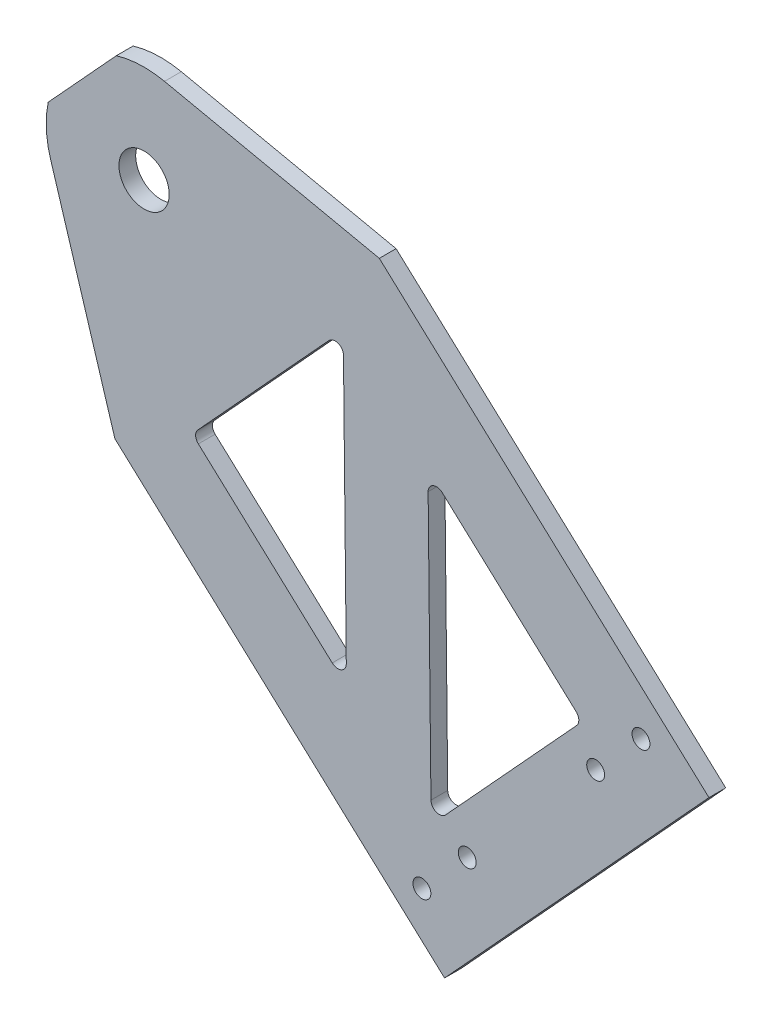
ISO-10303-21;
HEADER;
FILE_DESCRIPTION(('STEP AP214'),'2;1');
FILE_NAME('part.step','',(''),(''),'','','');
FILE_SCHEMA(('AUTOMOTIVE_DESIGN { 1 0 10303 214 1 1 1 1 }'));
ENDSEC;
DATA;
#1=APPLICATION_CONTEXT('core data for automotive mechanical design processes');
#2=APPLICATION_PROTOCOL_DEFINITION('international standard','automotive_design',2000,#1);
#3=PRODUCT_CONTEXT('',#1,'mechanical');
#4=PRODUCT('Part','Part','',(#3));
#5=PRODUCT_RELATED_PRODUCT_CATEGORY('part','',(#4));
#6=PRODUCT_DEFINITION_FORMATION('','',#4);
#7=PRODUCT_DEFINITION_CONTEXT('part definition',#1,'design');
#8=PRODUCT_DEFINITION('design','',#6,#7);
#9=PRODUCT_DEFINITION_SHAPE('','',#8);
#10=(LENGTH_UNIT() NAMED_UNIT(*) SI_UNIT(.MILLI.,.METRE.));
#11=(NAMED_UNIT(*) PLANE_ANGLE_UNIT() SI_UNIT($,.RADIAN.));
#12=(NAMED_UNIT(*) SI_UNIT($,.STERADIAN.) SOLID_ANGLE_UNIT());
#13=UNCERTAINTY_MEASURE_WITH_UNIT(LENGTH_MEASURE(1.E-05),#10,'distance_accuracy_value','');
#14=(GEOMETRIC_REPRESENTATION_CONTEXT(3) GLOBAL_UNCERTAINTY_ASSIGNED_CONTEXT((#13)) GLOBAL_UNIT_ASSIGNED_CONTEXT((#10,
#11,#12)) REPRESENTATION_CONTEXT('',''));
#15=CARTESIAN_POINT('',(0.,0.,0.));
#16=DIRECTION('',(0.,0.,1.));
#17=DIRECTION('',(1.,0.,0.));
#18=AXIS2_PLACEMENT_3D('',#15,#16,#17);
#19=CARTESIAN_POINT('',(0.,0.,3.));
#20=DIRECTION('',(0.,0.,1.));
#21=DIRECTION('',(1.,0.,0.));
#22=AXIS2_PLACEMENT_3D('',#19,#20,#21);
#23=PLANE('',#22);
#24=CARTESIAN_POINT('',(-348.654763938921,-91.0126847941198,3.));
#25=DIRECTION('',(0.,0.,1.));
#26=DIRECTION('',(1.,0.,0.));
#27=AXIS2_PLACEMENT_3D('',#24,#25,#26);
#28=CIRCLE('',#27,1.50000000000006);
#29=CARTESIAN_POINT('',(-349.668317731851,-92.1184463908653,3.));
#30=VERTEX_POINT('',#29);
#31=CARTESIAN_POINT('',(-347.154848014259,-90.9968033916056,3.));
#32=VERTEX_POINT('',#31);
#33=EDGE_CURVE('E59',#30,#32,#28,.T.);
#34=ORIENTED_EDGE('',*,*,#33,.F.);
#35=DIRECTION('',(0.737174397830323,-0.675702528620028,0.));
#36=VECTOR('',#35,1.);
#37=CARTESIAN_POINT('',(-373.620721285809,-70.1633979035986,3.));
#38=LINE('',#37,#36);
#39=CARTESIAN_POINT('',(-373.620721285809,-70.1633979035986,3.));
#40=VERTEX_POINT('',#39);
#41=EDGE_CURVE('E242',#40,#30,#38,.T.);
#42=ORIENTED_EDGE('',*,*,#41,.F.);
#43=CARTESIAN_POINT('',(-372.607167492879,-69.0576363068532,3.));
#44=DIRECTION('',(0.,0.,1.));
#45=DIRECTION('',(-1.,0.,0.));
#46=AXIS2_PLACEMENT_3D('',#43,#44,#45);
#47=CIRCLE('',#46,1.5);
#48=CARTESIAN_POINT('',(-373.712929089624,-68.0440825139232,3.));
#49=VERTEX_POINT('',#48);
#50=EDGE_CURVE('E268',#49,#40,#47,.T.);
#51=ORIENTED_EDGE('',*,*,#50,.F.);
#52=DIRECTION('',(-0.675702528620026,-0.737174397830326,0.));
#53=VECTOR('',#52,1.);
#54=CARTESIAN_POINT('',(-350.263860698121,-42.4617409671316,3.));
#55=LINE('',#54,#53);
#56=CARTESIAN_POINT('',(-350.263860698121,-42.4617409671316,3.));
#57=VERTEX_POINT('',#56);
#58=EDGE_CURVE('E265',#57,#49,#55,.T.);
#59=ORIENTED_EDGE('',*,*,#58,.F.);
#60=CARTESIAN_POINT('',(-349.158099101376,-43.4752947600617,3.));
#61=DIRECTION('',(0.,0.,1.));
#62=DIRECTION('',(1.,0.,0.));
#63=AXIS2_PLACEMENT_3D('',#60,#61,#62);
#64=CIRCLE('',#63,1.5);
#65=CARTESIAN_POINT('',(-347.658183176714,-43.4594133575474,3.));
#66=VERTEX_POINT('',#65);
#67=EDGE_CURVE('E262',#66,#57,#64,.T.);
#68=ORIENTED_EDGE('',*,*,#67,.F.);
#69=DIRECTION('',(-0.010587601676172,0.999943949774559,0.));
#70=VECTOR('',#69,1.);
#71=CARTESIAN_POINT('',(-347.154848014259,-90.9968033916056,3.));
#72=LINE('',#71,#70);
#73=EDGE_CURVE('E259',#32,#66,#72,.T.);
#74=ORIENTED_EDGE('',*,*,#73,.F.);
#75=EDGE_LOOP('',(#34,#42,#51,#59,#68,#74));
#76=FACE_BOUND('',#75,.T.);
#77=CARTESIAN_POINT('',(-307.06158205327,-78.9458226612326,3.));
#78=DIRECTION('',(0.,0.,1.));
#79=DIRECTION('',(-1.,0.,0.));
#80=AXIS2_PLACEMENT_3D('',#77,#78,#79);
#81=CIRCLE('',#80,1.5);
#82=CARTESIAN_POINT('',(-305.955820456524,-79.9593764541626,3.));
#83=VERTEX_POINT('',#82);
#84=CARTESIAN_POINT('',(-306.04802826034,-77.8400610644871,3.));
#85=VERTEX_POINT('',#84);
#86=EDGE_CURVE('E67',#83,#85,#81,.T.);
#87=ORIENTED_EDGE('',*,*,#86,.F.);
#88=DIRECTION('',(0.675702528620026,0.737174397830326,0.));
#89=VECTOR('',#88,1.);
#90=CARTESIAN_POINT('',(-305.955820456524,-79.9593764541626,3.));
#91=LINE('',#90,#89);
#92=CARTESIAN_POINT('',(-329.404888848027,-105.541718000954,3.));
#93=VERTEX_POINT('',#92);
#94=EDGE_CURVE('E203',#93,#83,#91,.T.);
#95=ORIENTED_EDGE('',*,*,#94,.F.);
#96=CARTESIAN_POINT('',(-330.510650444772,-104.528164208024,3.));
#97=DIRECTION('',(0.,0.,1.));
#98=DIRECTION('',(-1.,0.,0.));
#99=AXIS2_PLACEMENT_3D('',#96,#97,#98);
#100=CIRCLE('',#99,1.50000000000003);
#101=CARTESIAN_POINT('',(-332.010566369434,-104.544045610538,3.));
#102=VERTEX_POINT('',#101);
#103=EDGE_CURVE('E206',#102,#93,#100,.T.);
#104=ORIENTED_EDGE('',*,*,#103,.F.);
#105=DIRECTION('',(0.0105876016761709,-0.999943949774559,0.));
#106=VECTOR('',#105,1.);
#107=CARTESIAN_POINT('',(-332.010566369434,-104.544045610538,3.));
#108=LINE('',#107,#106);
#109=CARTESIAN_POINT('',(-332.513901531889,-57.0066555764802,3.));
#110=VERTEX_POINT('',#109);
#111=EDGE_CURVE('E223',#110,#102,#108,.T.);
#112=ORIENTED_EDGE('',*,*,#111,.F.);
#113=CARTESIAN_POINT('',(-331.013985607227,-56.9907741739659,3.));
#114=DIRECTION('',(0.,0.,1.));
#115=DIRECTION('',(1.,0.,0.));
#116=AXIS2_PLACEMENT_3D('',#113,#114,#115);
#117=CIRCLE('',#116,1.50000000000002);
#118=CARTESIAN_POINT('',(-330.000431814297,-55.8850125772205,3.));
#119=VERTEX_POINT('',#118);
#120=EDGE_CURVE('E220',#119,#110,#117,.T.);
#121=ORIENTED_EDGE('',*,*,#120,.F.);
#122=DIRECTION('',(-0.737174397830325,0.675702528620026,0.));
#123=VECTOR('',#122,1.);
#124=CARTESIAN_POINT('',(-330.000431814297,-55.8850125772205,3.));
#125=LINE('',#124,#123);
#126=EDGE_CURVE('E217',#85,#119,#125,.T.);
#127=ORIENTED_EDGE('',*,*,#126,.F.);
#128=EDGE_LOOP('',(#87,#95,#104,#112,#121,#127));
#129=FACE_BOUND('',#128,.T.);
#130=CARTESIAN_POINT('',(-383.327664245028,-34.1352802955979,3.));
#131=DIRECTION('',(0.,0.,-1.));
#132=DIRECTION('',(1.,0.,0.));
#133=AXIS2_PLACEMENT_3D('',#130,#131,#132);
#134=CIRCLE('',#133,17.5);
#135=CARTESIAN_POINT('',(-400.059680241249,-39.2626227556066,3.));
#136=VERTEX_POINT('',#135);
#137=CARTESIAN_POINT('',(-400.475980497187,-30.6445425919097,3.));
#138=VERTEX_POINT('',#137);
#139=EDGE_CURVE('E294',#136,#138,#134,.T.);
#140=ORIENTED_EDGE('',*,*,#139,.F.);
#141=DIRECTION('',(-0.292990997714777,0.956115199784053,0.));
#142=VECTOR('',#141,1.);
#143=CARTESIAN_POINT('',(-400.059680241249,-39.2626227556066,3.));
#144=LINE('',#143,#142);
#145=CARTESIAN_POINT('',(-388.547892801006,-76.8289474350234,3.));
#146=VERTEX_POINT('',#145);
#147=EDGE_CURVE('E298',#146,#136,#144,.T.);
#148=ORIENTED_EDGE('',*,*,#147,.F.);
#149=DIRECTION('',(0.737174397830325,-0.675702528620026,0.));
#150=VECTOR('',#149,1.);
#151=CARTESIAN_POINT('',(-329.57394097458,-130.885149724625,3.));
#152=LINE('',#151,#150);
#153=CARTESIAN_POINT('',(-329.57394097458,-130.885149724625,3.));
#154=VERTEX_POINT('',#153);
#155=EDGE_CURVE('E341',#146,#154,#152,.T.);
#156=ORIENTED_EDGE('',*,*,#155,.T.);
#157=DIRECTION('',(0.675702528620027,0.737174397830325,0.));
#158=VECTOR('',#157,1.);
#159=CARTESIAN_POINT('',(-329.57394097458,-130.885149724625,3.));
#160=LINE('',#159,#158);
#161=CARTESIAN_POINT('',(-282.274763971178,-79.2829418765027,3.));
#162=VERTEX_POINT('',#161);
#163=EDGE_CURVE('E343',#154,#162,#160,.T.);
#164=ORIENTED_EDGE('',*,*,#163,.T.);
#165=DIRECTION('',(-0.737174397830325,0.675702528620027,0.));
#166=VECTOR('',#165,1.);
#167=CARTESIAN_POINT('',(-282.274763971178,-79.2829418765027,3.));
#168=LINE('',#167,#166);
#169=CARTESIAN_POINT('',(-341.248715797604,-25.2267395869006,3.));
#170=VERTEX_POINT('',#169);
#171=EDGE_CURVE('E346',#162,#170,#168,.T.);
#172=ORIENTED_EDGE('',*,*,#171,.T.);
#173=DIRECTION('',(0.977949149077986,-0.208843151234706,0.));
#174=VECTOR('',#173,1.);
#175=CARTESIAN_POINT('',(-341.248715797604,-25.2267395869006,3.));
#176=LINE('',#175,#174);
#177=CARTESIAN_POINT('',(-379.672909098421,-17.0211701867332,3.));
#178=VERTEX_POINT('',#177);
#179=EDGE_CURVE('E296',#178,#170,#176,.T.);
#180=ORIENTED_EDGE('',*,*,#179,.F.);
#181=CARTESIAN_POINT('',(-388.294579927957,-17.3549421405226,3.));
#182=VERTEX_POINT('',#181);
#183=EDGE_CURVE('E230',#182,#178,#134,.T.);
#184=ORIENTED_EDGE('',*,*,#183,.F.);
#185=DIRECTION('',(-0.675702528620028,-0.737174397830324,0.));
#186=VECTOR('',#185,1.);
#187=CARTESIAN_POINT('',(-404.52081814182,-35.0573583336142,3.));
#188=LINE('',#187,#186);
#189=EDGE_CURVE('E349',#182,#138,#188,.T.);
#190=ORIENTED_EDGE('',*,*,#189,.T.);
#191=EDGE_LOOP('',(#140,#148,#156,#164,#172,#180,#184,#190));
#192=FACE_BOUND('',#191,.T.);
#193=CARTESIAN_POINT('',(-302.546327862472,-85.1193532226283,3.));
#194=DIRECTION('',(0.,0.,1.));
#195=DIRECTION('',(1.,0.,0.));
#196=AXIS2_PLACEMENT_3D('',#193,#194,#195);
#197=CIRCLE('',#196,1.6000000000002);
#198=CARTESIAN_POINT('',(-300.946327862472,-85.1193532226283,3.));
#199=VERTEX_POINT('',#198);
#200=EDGE_CURVE('E317',#199,#199,#197,.T.);
#201=ORIENTED_EDGE('',*,*,#200,.F.);
#202=EDGE_LOOP('',(#201));
#203=FACE_BOUND('',#202,.T.);
#204=CARTESIAN_POINT('',(-333.628644178994,-119.029375522823,3.));
#205=DIRECTION('',(0.,0.,1.));
#206=DIRECTION('',(1.,0.,0.));
#207=AXIS2_PLACEMENT_3D('',#204,#205,#206);
#208=CIRCLE('',#207,1.60000000000031);
#209=CARTESIAN_POINT('',(-332.028644178993,-119.029375522823,3.));
#210=VERTEX_POINT('',#209);
#211=EDGE_CURVE('E329',#210,#210,#208,.T.);
#212=ORIENTED_EDGE('',*,*,#211,.F.);
#213=EDGE_LOOP('',(#212));
#214=FACE_BOUND('',#213,.T.);
#215=CARTESIAN_POINT('',(-383.327664245063,-34.1352802954613,3.));
#216=DIRECTION('',(0.,0.,1.));
#217=DIRECTION('',(1.,0.,0.));
#218=AXIS2_PLACEMENT_3D('',#215,#216,#217);
#219=CIRCLE('',#218,4.49999999999995);
#220=CARTESIAN_POINT('',(-378.827664245063,-34.1352802954613,3.));
#221=VERTEX_POINT('',#220);
#222=EDGE_CURVE('E335',#221,#221,#219,.T.);
#223=ORIENTED_EDGE('',*,*,#222,.F.);
#224=EDGE_LOOP('',(#223));
#225=FACE_BOUND('',#224,.T.);
#226=CARTESIAN_POINT('',(-325.520213835553,-110.183282748859,3.));
#227=DIRECTION('',(0.,0.,1.));
#228=DIRECTION('',(1.,0.,0.));
#229=AXIS2_PLACEMENT_3D('',#226,#227,#228);
#230=CIRCLE('',#229,1.6000000000002);
#231=CARTESIAN_POINT('',(-323.920213835553,-110.183282748859,3.));
#232=VERTEX_POINT('',#231);
#233=EDGE_CURVE('E323',#232,#232,#230,.T.);
#234=ORIENTED_EDGE('',*,*,#233,.F.);
#235=EDGE_LOOP('',(#234));
#236=FACE_BOUND('',#235,.T.);
#237=CARTESIAN_POINT('',(-294.437897519032,-76.2732604486643,3.));
#238=DIRECTION('',(0.,0.,1.));
#239=DIRECTION('',(1.,0.,0.));
#240=AXIS2_PLACEMENT_3D('',#237,#238,#239);
#241=CIRCLE('',#240,1.60000000000025);
#242=CARTESIAN_POINT('',(-292.837897519032,-76.2732604486643,3.));
#243=VERTEX_POINT('',#242);
#244=EDGE_CURVE('E311',#243,#243,#241,.T.);
#245=ORIENTED_EDGE('',*,*,#244,.F.);
#246=EDGE_LOOP('',(#245));
#247=FACE_BOUND('',#246,.T.);
#248=ADVANCED_FACE('F44',(#76,#129,#192,#203,#214,#225,#236,#247),#23,.T.);
#249=CARTESIAN_POINT('',(0.,0.,0.));
#250=DIRECTION('',(0.,0.,1.));
#251=DIRECTION('',(1.,0.,0.));
#252=AXIS2_PLACEMENT_3D('',#249,#250,#251);
#253=PLANE('',#252);
#254=DIRECTION('',(0.737174397830323,-0.675702528620028,0.));
#255=VECTOR('',#254,1.);
#256=CARTESIAN_POINT('',(-373.620721285809,-70.1633979035986,0.));
#257=LINE('',#256,#255);
#258=CARTESIAN_POINT('',(-373.620721285809,-70.1633979035986,0.));
#259=VERTEX_POINT('',#258);
#260=CARTESIAN_POINT('',(-349.668317731851,-92.1184463908653,0.));
#261=VERTEX_POINT('',#260);
#262=EDGE_CURVE('E254',#259,#261,#257,.T.);
#263=ORIENTED_EDGE('',*,*,#262,.T.);
#264=CARTESIAN_POINT('',(-348.654763938921,-91.0126847941198,0.));
#265=DIRECTION('',(0.,0.,1.));
#266=DIRECTION('',(1.,0.,0.));
#267=AXIS2_PLACEMENT_3D('',#264,#265,#266);
#268=CIRCLE('',#267,1.50000000000006);
#269=CARTESIAN_POINT('',(-347.154848014259,-90.9968033916056,0.));
#270=VERTEX_POINT('',#269);
#271=EDGE_CURVE('E238',#261,#270,#268,.T.);
#272=ORIENTED_EDGE('',*,*,#271,.T.);
#273=DIRECTION('',(-0.010587601676172,0.999943949774559,0.));
#274=VECTOR('',#273,1.);
#275=CARTESIAN_POINT('',(-347.154848014259,-90.9968033916056,0.));
#276=LINE('',#275,#274);
#277=CARTESIAN_POINT('',(-347.658183176714,-43.4594133575474,0.));
#278=VERTEX_POINT('',#277);
#279=EDGE_CURVE('E241',#270,#278,#276,.T.);
#280=ORIENTED_EDGE('',*,*,#279,.T.);
#281=CARTESIAN_POINT('',(-349.158099101376,-43.4752947600617,0.));
#282=DIRECTION('',(0.,0.,1.));
#283=DIRECTION('',(1.,0.,0.));
#284=AXIS2_PLACEMENT_3D('',#281,#282,#283);
#285=CIRCLE('',#284,1.5);
#286=CARTESIAN_POINT('',(-350.263860698121,-42.4617409671316,0.));
#287=VERTEX_POINT('',#286);
#288=EDGE_CURVE('E245',#278,#287,#285,.T.);
#289=ORIENTED_EDGE('',*,*,#288,.T.);
#290=DIRECTION('',(-0.675702528620026,-0.737174397830326,0.));
#291=VECTOR('',#290,1.);
#292=CARTESIAN_POINT('',(-350.263860698121,-42.4617409671316,0.));
#293=LINE('',#292,#291);
#294=CARTESIAN_POINT('',(-373.712929089624,-68.0440825139232,0.));
#295=VERTEX_POINT('',#294);
#296=EDGE_CURVE('E248',#287,#295,#293,.T.);
#297=ORIENTED_EDGE('',*,*,#296,.T.);
#298=CARTESIAN_POINT('',(-372.607167492879,-69.0576363068532,0.));
#299=DIRECTION('',(0.,0.,1.));
#300=DIRECTION('',(-1.,0.,0.));
#301=AXIS2_PLACEMENT_3D('',#298,#299,#300);
#302=CIRCLE('',#301,1.5);
#303=EDGE_CURVE('E251',#295,#259,#302,.T.);
#304=ORIENTED_EDGE('',*,*,#303,.T.);
#305=EDGE_LOOP('',(#263,#272,#280,#289,#297,#304));
#306=FACE_BOUND('',#305,.T.);
#307=DIRECTION('',(0.675702528620026,0.737174397830326,0.));
#308=VECTOR('',#307,1.);
#309=CARTESIAN_POINT('',(-305.955820456524,-79.9593764541626,0.));
#310=LINE('',#309,#308);
#311=CARTESIAN_POINT('',(-329.404888848027,-105.541718000954,0.));
#312=VERTEX_POINT('',#311);
#313=CARTESIAN_POINT('',(-305.955820456524,-79.9593764541626,0.));
#314=VERTEX_POINT('',#313);
#315=EDGE_CURVE('E189',#312,#314,#310,.T.);
#316=ORIENTED_EDGE('',*,*,#315,.T.);
#317=CARTESIAN_POINT('',(-307.06158205327,-78.9458226612326,0.));
#318=DIRECTION('',(0.,0.,1.));
#319=DIRECTION('',(-1.,0.,0.));
#320=AXIS2_PLACEMENT_3D('',#317,#318,#319);
#321=CIRCLE('',#320,1.5);
#322=CARTESIAN_POINT('',(-306.04802826034,-77.8400610644871,0.));
#323=VERTEX_POINT('',#322);
#324=EDGE_CURVE('E183',#314,#323,#321,.T.);
#325=ORIENTED_EDGE('',*,*,#324,.T.);
#326=DIRECTION('',(-0.737174397830325,0.675702528620026,0.));
#327=VECTOR('',#326,1.);
#328=CARTESIAN_POINT('',(-330.000431814297,-55.8850125772205,0.));
#329=LINE('',#328,#327);
#330=CARTESIAN_POINT('',(-330.000431814297,-55.8850125772205,0.));
#331=VERTEX_POINT('',#330);
#332=EDGE_CURVE('E193',#323,#331,#329,.T.);
#333=ORIENTED_EDGE('',*,*,#332,.T.);
#334=CARTESIAN_POINT('',(-331.013985607227,-56.9907741739659,0.));
#335=DIRECTION('',(0.,0.,1.));
#336=DIRECTION('',(1.,0.,0.));
#337=AXIS2_PLACEMENT_3D('',#334,#335,#336);
#338=CIRCLE('',#337,1.50000000000002);
#339=CARTESIAN_POINT('',(-332.513901531889,-57.0066555764802,0.));
#340=VERTEX_POINT('',#339);
#341=EDGE_CURVE('E197',#331,#340,#338,.T.);
#342=ORIENTED_EDGE('',*,*,#341,.T.);
#343=DIRECTION('',(0.0105876016761709,-0.999943949774559,0.));
#344=VECTOR('',#343,1.);
#345=CARTESIAN_POINT('',(-332.010566369434,-104.544045610538,0.));
#346=LINE('',#345,#344);
#347=CARTESIAN_POINT('',(-332.010566369434,-104.544045610538,0.));
#348=VERTEX_POINT('',#347);
#349=EDGE_CURVE('E210',#340,#348,#346,.T.);
#350=ORIENTED_EDGE('',*,*,#349,.T.);
#351=CARTESIAN_POINT('',(-330.510650444772,-104.528164208024,0.));
#352=DIRECTION('',(0.,0.,1.));
#353=DIRECTION('',(-1.,0.,0.));
#354=AXIS2_PLACEMENT_3D('',#351,#352,#353);
#355=CIRCLE('',#354,1.50000000000003);
#356=EDGE_CURVE('E213',#348,#312,#355,.T.);
#357=ORIENTED_EDGE('',*,*,#356,.T.);
#358=EDGE_LOOP('',(#316,#325,#333,#342,#350,#357));
#359=FACE_BOUND('',#358,.T.);
#360=DIRECTION('',(-0.292990997714777,0.956115199784053,0.));
#361=VECTOR('',#360,1.);
#362=CARTESIAN_POINT('',(-400.059680241249,-39.2626227556066,0.));
#363=LINE('',#362,#361);
#364=CARTESIAN_POINT('',(-388.547892801006,-76.8289474350234,0.));
#365=VERTEX_POINT('',#364);
#366=CARTESIAN_POINT('',(-400.059680241249,-39.2626227556066,0.));
#367=VERTEX_POINT('',#366);
#368=EDGE_CURVE('E290',#365,#367,#363,.T.);
#369=ORIENTED_EDGE('',*,*,#368,.T.);
#370=CARTESIAN_POINT('',(-383.327664245028,-34.1352802955979,0.));
#371=DIRECTION('',(0.,0.,-1.));
#372=DIRECTION('',(1.,0.,0.));
#373=AXIS2_PLACEMENT_3D('',#370,#371,#372);
#374=CIRCLE('',#373,17.5);
#375=CARTESIAN_POINT('',(-400.475980497187,-30.6445425919097,0.));
#376=VERTEX_POINT('',#375);
#377=EDGE_CURVE('E283',#367,#376,#374,.T.);
#378=ORIENTED_EDGE('',*,*,#377,.T.);
#379=DIRECTION('',(-0.675702528620028,-0.737174397830324,0.));
#380=VECTOR('',#379,1.);
#381=CARTESIAN_POINT('',(-404.52081814182,-35.0573583336142,0.));
#382=LINE('',#381,#380);
#383=CARTESIAN_POINT('',(-388.294579927957,-17.3549421405226,0.));
#384=VERTEX_POINT('',#383);
#385=EDGE_CURVE('E344',#384,#376,#382,.T.);
#386=ORIENTED_EDGE('',*,*,#385,.F.);
#387=CARTESIAN_POINT('',(-379.672909098421,-17.0211701867332,0.));
#388=VERTEX_POINT('',#387);
#389=EDGE_CURVE('E287',#384,#388,#374,.T.);
#390=ORIENTED_EDGE('',*,*,#389,.T.);
#391=DIRECTION('',(0.977949149077986,-0.208843151234706,0.));
#392=VECTOR('',#391,1.);
#393=CARTESIAN_POINT('',(-341.248715797604,-25.2267395869006,0.));
#394=LINE('',#393,#392);
#395=CARTESIAN_POINT('',(-341.248715797604,-25.2267395869006,0.));
#396=VERTEX_POINT('',#395);
#397=EDGE_CURVE('E286',#388,#396,#394,.T.);
#398=ORIENTED_EDGE('',*,*,#397,.T.);
#399=DIRECTION('',(-0.737174397830325,0.675702528620027,0.));
#400=VECTOR('',#399,1.);
#401=CARTESIAN_POINT('',(-282.274763971178,-79.2829418765027,0.));
#402=LINE('',#401,#400);
#403=CARTESIAN_POINT('',(-282.274763971178,-79.2829418765027,0.));
#404=VERTEX_POINT('',#403);
#405=EDGE_CURVE('E356',#404,#396,#402,.T.);
#406=ORIENTED_EDGE('',*,*,#405,.F.);
#407=DIRECTION('',(0.675702528620027,0.737174397830325,0.));
#408=VECTOR('',#407,1.);
#409=CARTESIAN_POINT('',(-329.57394097458,-130.885149724625,0.));
#410=LINE('',#409,#408);
#411=CARTESIAN_POINT('',(-329.57394097458,-130.885149724625,0.));
#412=VERTEX_POINT('',#411);
#413=EDGE_CURVE('E354',#412,#404,#410,.T.);
#414=ORIENTED_EDGE('',*,*,#413,.F.);
#415=DIRECTION('',(0.737174397830325,-0.675702528620026,0.));
#416=VECTOR('',#415,1.);
#417=CARTESIAN_POINT('',(-329.57394097458,-130.885149724625,0.));
#418=LINE('',#417,#416);
#419=EDGE_CURVE('E338',#365,#412,#418,.T.);
#420=ORIENTED_EDGE('',*,*,#419,.F.);
#421=EDGE_LOOP('',(#369,#378,#386,#390,#398,#406,#414,#420));
#422=FACE_BOUND('',#421,.T.);
#423=CARTESIAN_POINT('',(-383.327664245063,-34.1352802954613,0.));
#424=DIRECTION('',(0.,0.,1.));
#425=DIRECTION('',(1.,0.,0.));
#426=AXIS2_PLACEMENT_3D('',#423,#424,#425);
#427=CIRCLE('',#426,4.49999999999995);
#428=CARTESIAN_POINT('',(-378.827664245063,-34.1352802954613,0.));
#429=VERTEX_POINT('',#428);
#430=EDGE_CURVE('E332',#429,#429,#427,.T.);
#431=ORIENTED_EDGE('',*,*,#430,.T.);
#432=EDGE_LOOP('',(#431));
#433=FACE_BOUND('',#432,.T.);
#434=CARTESIAN_POINT('',(-333.628644178994,-119.029375522823,0.));
#435=DIRECTION('',(0.,0.,1.));
#436=DIRECTION('',(1.,0.,0.));
#437=AXIS2_PLACEMENT_3D('',#434,#435,#436);
#438=CIRCLE('',#437,1.60000000000031);
#439=CARTESIAN_POINT('',(-332.028644178993,-119.029375522823,0.));
#440=VERTEX_POINT('',#439);
#441=EDGE_CURVE('E326',#440,#440,#438,.T.);
#442=ORIENTED_EDGE('',*,*,#441,.T.);
#443=EDGE_LOOP('',(#442));
#444=FACE_BOUND('',#443,.T.);
#445=CARTESIAN_POINT('',(-325.520213835553,-110.183282748859,0.));
#446=DIRECTION('',(0.,0.,1.));
#447=DIRECTION('',(1.,0.,0.));
#448=AXIS2_PLACEMENT_3D('',#445,#446,#447);
#449=CIRCLE('',#448,1.6000000000002);
#450=CARTESIAN_POINT('',(-323.920213835553,-110.183282748859,0.));
#451=VERTEX_POINT('',#450);
#452=EDGE_CURVE('E320',#451,#451,#449,.T.);
#453=ORIENTED_EDGE('',*,*,#452,.T.);
#454=EDGE_LOOP('',(#453));
#455=FACE_BOUND('',#454,.T.);
#456=CARTESIAN_POINT('',(-302.546327862472,-85.1193532226283,0.));
#457=DIRECTION('',(0.,0.,1.));
#458=DIRECTION('',(1.,0.,0.));
#459=AXIS2_PLACEMENT_3D('',#456,#457,#458);
#460=CIRCLE('',#459,1.6000000000002);
#461=CARTESIAN_POINT('',(-300.946327862472,-85.1193532226283,0.));
#462=VERTEX_POINT('',#461);
#463=EDGE_CURVE('E314',#462,#462,#460,.T.);
#464=ORIENTED_EDGE('',*,*,#463,.T.);
#465=EDGE_LOOP('',(#464));
#466=FACE_BOUND('',#465,.T.);
#467=CARTESIAN_POINT('',(-294.437897519032,-76.2732604486643,0.));
#468=DIRECTION('',(0.,0.,1.));
#469=DIRECTION('',(1.,0.,0.));
#470=AXIS2_PLACEMENT_3D('',#467,#468,#469);
#471=CIRCLE('',#470,1.60000000000025);
#472=CARTESIAN_POINT('',(-292.837897519032,-76.2732604486643,0.));
#473=VERTEX_POINT('',#472);
#474=EDGE_CURVE('E303',#473,#473,#471,.T.);
#475=ORIENTED_EDGE('',*,*,#474,.T.);
#476=EDGE_LOOP('',(#475));
#477=FACE_BOUND('',#476,.T.);
#478=ADVANCED_FACE('F199',(#306,#359,#422,#433,#444,#455,#466,#477),#253,.F.);
#479=CARTESIAN_POINT('',(-329.57394097458,-130.885149724625,3.));
#480=DIRECTION('',(0.675702528620026,0.737174397830325,0.));
#481=DIRECTION('',(-0.737174397830325,0.675702528620026,0.));
#482=AXIS2_PLACEMENT_3D('',#479,#480,#481);
#483=PLANE('',#482);
#484=ORIENTED_EDGE('',*,*,#155,.F.);
#485=DIRECTION('',(0.,0.,1.));
#486=VECTOR('',#485,1.);
#487=CARTESIAN_POINT('',(-388.547892801006,-76.8289474350234,0.));
#488=LINE('',#487,#486);
#489=EDGE_CURVE('E304',#365,#146,#488,.T.);
#490=ORIENTED_EDGE('',*,*,#489,.F.);
#491=ORIENTED_EDGE('',*,*,#419,.T.);
#492=DIRECTION('',(0.,0.,-1.));
#493=VECTOR('',#492,1.);
#494=CARTESIAN_POINT('',(-329.57394097458,-130.885149724625,3.));
#495=LINE('',#494,#493);
#496=EDGE_CURVE('E363',#154,#412,#495,.T.);
#497=ORIENTED_EDGE('',*,*,#496,.F.);
#498=EDGE_LOOP('',(#484,#490,#491,#497));
#499=FACE_BOUND('',#498,.T.);
#500=ADVANCED_FACE('F46',(#499),#483,.F.);
#501=CARTESIAN_POINT('',(-329.57394097458,-130.885149724625,3.));
#502=DIRECTION('',(-0.737174397830325,0.675702528620027,0.));
#503=DIRECTION('',(-0.675702528620027,-0.737174397830325,0.));
#504=AXIS2_PLACEMENT_3D('',#501,#502,#503);
#505=PLANE('',#504);
#506=ORIENTED_EDGE('',*,*,#413,.T.);
#507=DIRECTION('',(0.,0.,-1.));
#508=VECTOR('',#507,1.);
#509=CARTESIAN_POINT('',(-282.274763971178,-79.2829418765027,3.));
#510=LINE('',#509,#508);
#511=EDGE_CURVE('E352',#162,#404,#510,.T.);
#512=ORIENTED_EDGE('',*,*,#511,.F.);
#513=ORIENTED_EDGE('',*,*,#163,.F.);
#514=ORIENTED_EDGE('',*,*,#496,.T.);
#515=EDGE_LOOP('',(#506,#512,#513,#514));
#516=FACE_BOUND('',#515,.T.);
#517=ADVANCED_FACE('F398',(#516),#505,.F.);
#518=CARTESIAN_POINT('',(-282.274763971178,-79.2829418765027,3.));
#519=DIRECTION('',(-0.675702528620027,-0.737174397830325,0.));
#520=DIRECTION('',(0.737174397830325,-0.675702528620027,0.));
#521=AXIS2_PLACEMENT_3D('',#518,#519,#520);
#522=PLANE('',#521);
#523=ORIENTED_EDGE('',*,*,#405,.T.);
#524=DIRECTION('',(0.,0.,1.));
#525=VECTOR('',#524,1.);
#526=CARTESIAN_POINT('',(-341.248715797604,-25.2267395869006,0.));
#527=LINE('',#526,#525);
#528=EDGE_CURVE('E306',#396,#170,#527,.T.);
#529=ORIENTED_EDGE('',*,*,#528,.T.);
#530=ORIENTED_EDGE('',*,*,#171,.F.);
#531=ORIENTED_EDGE('',*,*,#511,.T.);
#532=EDGE_LOOP('',(#523,#529,#530,#531));
#533=FACE_BOUND('',#532,.T.);
#534=ADVANCED_FACE('F401',(#533),#522,.F.);
#535=CARTESIAN_POINT('',(-404.52081814182,-35.0573583336142,3.));
#536=DIRECTION('',(0.737174397830324,-0.675702528620028,0.));
#537=DIRECTION('',(0.675702528620028,0.737174397830324,0.));
#538=AXIS2_PLACEMENT_3D('',#535,#536,#537);
#539=PLANE('',#538);
#540=ORIENTED_EDGE('',*,*,#189,.F.);
#541=DIRECTION('',(0.,0.,1.));
#542=VECTOR('',#541,1.);
#543=CARTESIAN_POINT('',(-388.294579927957,-17.3549421405226,0.));
#544=LINE('',#543,#542);
#545=EDGE_CURVE('E13',#182,#384,#544,.F.);
#546=ORIENTED_EDGE('',*,*,#545,.T.);
#547=ORIENTED_EDGE('',*,*,#385,.T.);
#548=DIRECTION('',(0.,0.,1.));
#549=VECTOR('',#548,1.);
#550=CARTESIAN_POINT('',(-400.475980497187,-30.6445425919097,0.));
#551=LINE('',#550,#549);
#552=EDGE_CURVE('E52',#376,#138,#551,.T.);
#553=ORIENTED_EDGE('',*,*,#552,.T.);
#554=EDGE_LOOP('',(#540,#546,#547,#553));
#555=FACE_BOUND('',#554,.T.);
#556=ADVANCED_FACE('F368',(#555),#539,.F.);
#557=CARTESIAN_POINT('',(-383.327664245063,-34.1352802954613,3.));
#558=DIRECTION('',(0.,0.,-1.));
#559=DIRECTION('',(-1.,0.,0.));
#560=AXIS2_PLACEMENT_3D('',#557,#558,#559);
#561=CYLINDRICAL_SURFACE('',#560,4.49999999999995);
#562=ORIENTED_EDGE('',*,*,#222,.T.);
#563=EDGE_LOOP('',(#562));
#564=FACE_BOUND('',#563,.T.);
#565=ORIENTED_EDGE('',*,*,#430,.F.);
#566=EDGE_LOOP('',(#565));
#567=FACE_BOUND('',#566,.T.);
#568=ADVANCED_FACE('F408',(#564,#567),#561,.F.);
#569=CARTESIAN_POINT('',(-333.628644178994,-119.029375522823,3.));
#570=DIRECTION('',(0.,0.,-1.));
#571=DIRECTION('',(-1.,0.,0.));
#572=AXIS2_PLACEMENT_3D('',#569,#570,#571);
#573=CYLINDRICAL_SURFACE('',#572,1.60000000000031);
#574=ORIENTED_EDGE('',*,*,#211,.T.);
#575=EDGE_LOOP('',(#574));
#576=FACE_BOUND('',#575,.T.);
#577=ORIENTED_EDGE('',*,*,#441,.F.);
#578=EDGE_LOOP('',(#577));
#579=FACE_BOUND('',#578,.T.);
#580=ADVANCED_FACE('F424',(#576,#579),#573,.F.);
#581=CARTESIAN_POINT('',(-325.520213835553,-110.183282748859,3.));
#582=DIRECTION('',(0.,0.,-1.));
#583=DIRECTION('',(-1.,0.,0.));
#584=AXIS2_PLACEMENT_3D('',#581,#582,#583);
#585=CYLINDRICAL_SURFACE('',#584,1.6000000000002);
#586=ORIENTED_EDGE('',*,*,#233,.T.);
#587=EDGE_LOOP('',(#586));
#588=FACE_BOUND('',#587,.T.);
#589=ORIENTED_EDGE('',*,*,#452,.F.);
#590=EDGE_LOOP('',(#589));
#591=FACE_BOUND('',#590,.T.);
#592=ADVANCED_FACE('F428',(#588,#591),#585,.F.);
#593=CARTESIAN_POINT('',(-302.546327862472,-85.1193532226283,3.));
#594=DIRECTION('',(0.,0.,-1.));
#595=DIRECTION('',(-1.,0.,0.));
#596=AXIS2_PLACEMENT_3D('',#593,#594,#595);
#597=CYLINDRICAL_SURFACE('',#596,1.6000000000002);
#598=ORIENTED_EDGE('',*,*,#200,.T.);
#599=EDGE_LOOP('',(#598));
#600=FACE_BOUND('',#599,.T.);
#601=ORIENTED_EDGE('',*,*,#463,.F.);
#602=EDGE_LOOP('',(#601));
#603=FACE_BOUND('',#602,.T.);
#604=ADVANCED_FACE('F432',(#600,#603),#597,.F.);
#605=CARTESIAN_POINT('',(-294.437897519032,-76.2732604486643,3.));
#606=DIRECTION('',(0.,0.,-1.));
#607=DIRECTION('',(-1.,0.,0.));
#608=AXIS2_PLACEMENT_3D('',#605,#606,#607);
#609=CYLINDRICAL_SURFACE('',#608,1.60000000000025);
#610=ORIENTED_EDGE('',*,*,#244,.T.);
#611=EDGE_LOOP('',(#610));
#612=FACE_BOUND('',#611,.T.);
#613=ORIENTED_EDGE('',*,*,#474,.F.);
#614=EDGE_LOOP('',(#613));
#615=FACE_BOUND('',#614,.T.);
#616=ADVANCED_FACE('F436',(#612,#615),#609,.F.);
#617=CARTESIAN_POINT('',(-383.327664245028,-34.1352802955979,0.));
#618=DIRECTION('',(0.,0.,1.));
#619=DIRECTION('',(1.,0.,0.));
#620=AXIS2_PLACEMENT_3D('',#617,#618,#619);
#621=CYLINDRICAL_SURFACE('',#620,17.5);
#622=ORIENTED_EDGE('',*,*,#377,.F.);
#623=DIRECTION('',(0.,0.,1.));
#624=VECTOR('',#623,1.);
#625=CARTESIAN_POINT('',(-400.059680241249,-39.2626227556066,0.));
#626=LINE('',#625,#624);
#627=EDGE_CURVE('E301',#367,#136,#626,.T.);
#628=ORIENTED_EDGE('',*,*,#627,.T.);
#629=ORIENTED_EDGE('',*,*,#139,.T.);
#630=ORIENTED_EDGE('',*,*,#552,.F.);
#631=EDGE_LOOP('',(#622,#628,#629,#630));
#632=FACE_BOUND('',#631,.T.);
#633=ADVANCED_FACE('F387',(#632),#621,.T.);
#634=CARTESIAN_POINT('',(-400.059680241249,-39.2626227556066,0.));
#635=DIRECTION('',(0.956115199784053,0.292990997714777,0.));
#636=DIRECTION('',(-0.292990997714777,0.956115199784053,0.));
#637=AXIS2_PLACEMENT_3D('',#634,#635,#636);
#638=PLANE('',#637);
#639=ORIENTED_EDGE('',*,*,#147,.T.);
#640=ORIENTED_EDGE('',*,*,#627,.F.);
#641=ORIENTED_EDGE('',*,*,#368,.F.);
#642=ORIENTED_EDGE('',*,*,#489,.T.);
#643=EDGE_LOOP('',(#639,#640,#641,#642));
#644=FACE_BOUND('',#643,.T.);
#645=ADVANCED_FACE('F389',(#644),#638,.F.);
#646=ORIENTED_EDGE('',*,*,#183,.T.);
#647=DIRECTION('',(0.,0.,1.));
#648=VECTOR('',#647,1.);
#649=CARTESIAN_POINT('',(-379.672909098421,-17.0211701867332,0.));
#650=LINE('',#649,#648);
#651=EDGE_CURVE('E293',#388,#178,#650,.T.);
#652=ORIENTED_EDGE('',*,*,#651,.F.);
#653=ORIENTED_EDGE('',*,*,#389,.F.);
#654=ORIENTED_EDGE('',*,*,#545,.F.);
#655=EDGE_LOOP('',(#646,#652,#653,#654));
#656=FACE_BOUND('',#655,.T.);
#657=ADVANCED_FACE('F379',(#656),#621,.T.);
#658=CARTESIAN_POINT('',(-341.248715797604,-25.2267395869006,0.));
#659=DIRECTION('',(-0.208843151234706,-0.977949149077986,0.));
#660=DIRECTION('',(0.977949149077987,-0.208843151234706,0.));
#661=AXIS2_PLACEMENT_3D('',#658,#659,#660);
#662=PLANE('',#661);
#663=ORIENTED_EDGE('',*,*,#179,.T.);
#664=ORIENTED_EDGE('',*,*,#528,.F.);
#665=ORIENTED_EDGE('',*,*,#397,.F.);
#666=ORIENTED_EDGE('',*,*,#651,.T.);
#667=EDGE_LOOP('',(#663,#664,#665,#666));
#668=FACE_BOUND('',#667,.T.);
#669=ADVANCED_FACE('F382',(#668),#662,.F.);
#670=CARTESIAN_POINT('',(-307.06158205327,-78.9458226612326,0.));
#671=DIRECTION('',(0.,0.,1.));
#672=DIRECTION('',(1.,0.,0.));
#673=AXIS2_PLACEMENT_3D('',#670,#671,#672);
#674=CYLINDRICAL_SURFACE('',#673,1.5);
#675=ORIENTED_EDGE('',*,*,#86,.T.);
#676=DIRECTION('',(0.,0.,1.));
#677=VECTOR('',#676,1.);
#678=CARTESIAN_POINT('',(-306.04802826034,-77.8400610644871,0.));
#679=LINE('',#678,#677);
#680=EDGE_CURVE('E179',#323,#85,#679,.T.);
#681=ORIENTED_EDGE('',*,*,#680,.F.);
#682=ORIENTED_EDGE('',*,*,#324,.F.);
#683=DIRECTION('',(0.,0.,1.));
#684=VECTOR('',#683,1.);
#685=CARTESIAN_POINT('',(-305.955820456524,-79.9593764541626,0.));
#686=LINE('',#685,#684);
#687=EDGE_CURVE('E228',#314,#83,#686,.T.);
#688=ORIENTED_EDGE('',*,*,#687,.T.);
#689=EDGE_LOOP('',(#675,#681,#682,#688));
#690=FACE_BOUND('',#689,.T.);
#691=ADVANCED_FACE('F181',(#690),#674,.F.);
#692=CARTESIAN_POINT('',(-305.955820456524,-79.9593764541626,0.));
#693=DIRECTION('',(0.737174397830326,-0.675702528620026,0.));
#694=DIRECTION('',(0.675702528620026,0.737174397830326,0.));
#695=AXIS2_PLACEMENT_3D('',#692,#693,#694);
#696=PLANE('',#695);
#697=ORIENTED_EDGE('',*,*,#94,.T.);
#698=ORIENTED_EDGE('',*,*,#687,.F.);
#699=ORIENTED_EDGE('',*,*,#315,.F.);
#700=DIRECTION('',(0.,0.,1.));
#701=VECTOR('',#700,1.);
#702=CARTESIAN_POINT('',(-329.404888848027,-105.541718000954,0.));
#703=LINE('',#702,#701);
#704=EDGE_CURVE('E231',#312,#93,#703,.T.);
#705=ORIENTED_EDGE('',*,*,#704,.T.);
#706=EDGE_LOOP('',(#697,#698,#699,#705));
#707=FACE_BOUND('',#706,.T.);
#708=ADVANCED_FACE('F472',(#707),#696,.F.);
#709=CARTESIAN_POINT('',(-330.510650444772,-104.528164208024,0.));
#710=DIRECTION('',(0.,0.,1.));
#711=DIRECTION('',(1.,0.,0.));
#712=AXIS2_PLACEMENT_3D('',#709,#710,#711);
#713=CYLINDRICAL_SURFACE('',#712,1.50000000000003);
#714=ORIENTED_EDGE('',*,*,#103,.T.);
#715=ORIENTED_EDGE('',*,*,#704,.F.);
#716=ORIENTED_EDGE('',*,*,#356,.F.);
#717=DIRECTION('',(0.,0.,1.));
#718=VECTOR('',#717,1.);
#719=CARTESIAN_POINT('',(-332.010566369434,-104.544045610538,0.));
#720=LINE('',#719,#718);
#721=EDGE_CURVE('E233',#348,#102,#720,.T.);
#722=ORIENTED_EDGE('',*,*,#721,.T.);
#723=EDGE_LOOP('',(#714,#715,#716,#722));
#724=FACE_BOUND('',#723,.T.);
#725=ADVANCED_FACE('F482',(#724),#713,.F.);
#726=CARTESIAN_POINT('',(-332.010566369434,-104.544045610538,0.));
#727=DIRECTION('',(-0.99994394977456,-0.0105876016761709,0.));
#728=DIRECTION('',(0.0105876016761709,-0.99994394977456,0.));
#729=AXIS2_PLACEMENT_3D('',#726,#727,#728);
#730=PLANE('',#729);
#731=ORIENTED_EDGE('',*,*,#111,.T.);
#732=ORIENTED_EDGE('',*,*,#721,.F.);
#733=ORIENTED_EDGE('',*,*,#349,.F.);
#734=DIRECTION('',(0.,0.,1.));
#735=VECTOR('',#734,1.);
#736=CARTESIAN_POINT('',(-332.513901531889,-57.0066555764802,0.));
#737=LINE('',#736,#735);
#738=EDGE_CURVE('E235',#340,#110,#737,.T.);
#739=ORIENTED_EDGE('',*,*,#738,.T.);
#740=EDGE_LOOP('',(#731,#732,#733,#739));
#741=FACE_BOUND('',#740,.T.);
#742=ADVANCED_FACE('F478',(#741),#730,.F.);
#743=CARTESIAN_POINT('',(-331.013985607227,-56.9907741739659,0.));
#744=DIRECTION('',(0.,0.,1.));
#745=DIRECTION('',(1.,0.,0.));
#746=AXIS2_PLACEMENT_3D('',#743,#744,#745);
#747=CYLINDRICAL_SURFACE('',#746,1.50000000000002);
#748=ORIENTED_EDGE('',*,*,#120,.T.);
#749=ORIENTED_EDGE('',*,*,#738,.F.);
#750=ORIENTED_EDGE('',*,*,#341,.F.);
#751=DIRECTION('',(0.,0.,1.));
#752=VECTOR('',#751,1.);
#753=CARTESIAN_POINT('',(-330.000431814297,-55.8850125772205,0.));
#754=LINE('',#753,#752);
#755=EDGE_CURVE('E188',#331,#119,#754,.T.);
#756=ORIENTED_EDGE('',*,*,#755,.T.);
#757=EDGE_LOOP('',(#748,#749,#750,#756));
#758=FACE_BOUND('',#757,.T.);
#759=ADVANCED_FACE('F475',(#758),#747,.F.);
#760=CARTESIAN_POINT('',(-330.000431814297,-55.8850125772205,0.));
#761=DIRECTION('',(0.675702528620026,0.737174397830325,0.));
#762=DIRECTION('',(-0.737174397830325,0.675702528620026,0.));
#763=AXIS2_PLACEMENT_3D('',#760,#761,#762);
#764=PLANE('',#763);
#765=ORIENTED_EDGE('',*,*,#126,.T.);
#766=ORIENTED_EDGE('',*,*,#755,.F.);
#767=ORIENTED_EDGE('',*,*,#332,.F.);
#768=ORIENTED_EDGE('',*,*,#680,.T.);
#769=EDGE_LOOP('',(#765,#766,#767,#768));
#770=FACE_BOUND('',#769,.T.);
#771=ADVANCED_FACE('F194',(#770),#764,.F.);
#772=CARTESIAN_POINT('',(-348.654763938921,-91.0126847941198,0.));
#773=DIRECTION('',(0.,0.,1.));
#774=DIRECTION('',(1.,0.,0.));
#775=AXIS2_PLACEMENT_3D('',#772,#773,#774);
#776=CYLINDRICAL_SURFACE('',#775,1.50000000000006);
#777=ORIENTED_EDGE('',*,*,#33,.T.);
#778=DIRECTION('',(0.,0.,1.));
#779=VECTOR('',#778,1.);
#780=CARTESIAN_POINT('',(-347.154848014259,-90.9968033916056,0.));
#781=LINE('',#780,#779);
#782=EDGE_CURVE('E257',#270,#32,#781,.T.);
#783=ORIENTED_EDGE('',*,*,#782,.F.);
#784=ORIENTED_EDGE('',*,*,#271,.F.);
#785=DIRECTION('',(0.,0.,1.));
#786=VECTOR('',#785,1.);
#787=CARTESIAN_POINT('',(-349.668317731851,-92.1184463908653,0.));
#788=LINE('',#787,#786);
#789=EDGE_CURVE('E218',#261,#30,#788,.T.);
#790=ORIENTED_EDGE('',*,*,#789,.T.);
#791=EDGE_LOOP('',(#777,#783,#784,#790));
#792=FACE_BOUND('',#791,.T.);
#793=ADVANCED_FACE('F447',(#792),#776,.F.);
#794=CARTESIAN_POINT('',(-373.620721285809,-70.1633979035986,0.));
#795=DIRECTION('',(-0.675702528620028,-0.737174397830323,0.));
#796=DIRECTION('',(0.737174397830323,-0.675702528620028,0.));
#797=AXIS2_PLACEMENT_3D('',#794,#795,#796);
#798=PLANE('',#797);
#799=ORIENTED_EDGE('',*,*,#41,.T.);
#800=ORIENTED_EDGE('',*,*,#789,.F.);
#801=ORIENTED_EDGE('',*,*,#262,.F.);
#802=DIRECTION('',(0.,0.,1.));
#803=VECTOR('',#802,1.);
#804=CARTESIAN_POINT('',(-373.620721285809,-70.1633979035986,0.));
#805=LINE('',#804,#803);
#806=EDGE_CURVE('E274',#259,#40,#805,.T.);
#807=ORIENTED_EDGE('',*,*,#806,.T.);
#808=EDGE_LOOP('',(#799,#800,#801,#807));
#809=FACE_BOUND('',#808,.T.);
#810=ADVANCED_FACE('F450',(#809),#798,.F.);
#811=CARTESIAN_POINT('',(-372.607167492879,-69.0576363068532,0.));
#812=DIRECTION('',(0.,0.,1.));
#813=DIRECTION('',(1.,0.,0.));
#814=AXIS2_PLACEMENT_3D('',#811,#812,#813);
#815=CYLINDRICAL_SURFACE('',#814,1.5);
#816=ORIENTED_EDGE('',*,*,#50,.T.);
#817=ORIENTED_EDGE('',*,*,#806,.F.);
#818=ORIENTED_EDGE('',*,*,#303,.F.);
#819=DIRECTION('',(0.,0.,1.));
#820=VECTOR('',#819,1.);
#821=CARTESIAN_POINT('',(-373.712929089624,-68.0440825139232,0.));
#822=LINE('',#821,#820);
#823=EDGE_CURVE('E276',#295,#49,#822,.T.);
#824=ORIENTED_EDGE('',*,*,#823,.T.);
#825=EDGE_LOOP('',(#816,#817,#818,#824));
#826=FACE_BOUND('',#825,.T.);
#827=ADVANCED_FACE('F462',(#826),#815,.F.);
#828=CARTESIAN_POINT('',(-350.263860698121,-42.4617409671316,0.));
#829=DIRECTION('',(-0.737174397830326,0.675702528620026,0.));
#830=DIRECTION('',(-0.675702528620026,-0.737174397830326,0.));
#831=AXIS2_PLACEMENT_3D('',#828,#829,#830);
#832=PLANE('',#831);
#833=ORIENTED_EDGE('',*,*,#58,.T.);
#834=ORIENTED_EDGE('',*,*,#823,.F.);
#835=ORIENTED_EDGE('',*,*,#296,.F.);
#836=DIRECTION('',(0.,0.,1.));
#837=VECTOR('',#836,1.);
#838=CARTESIAN_POINT('',(-350.263860698121,-42.4617409671316,0.));
#839=LINE('',#838,#837);
#840=EDGE_CURVE('E278',#287,#57,#839,.T.);
#841=ORIENTED_EDGE('',*,*,#840,.T.);
#842=EDGE_LOOP('',(#833,#834,#835,#841));
#843=FACE_BOUND('',#842,.T.);
#844=ADVANCED_FACE('F458',(#843),#832,.F.);
#845=CARTESIAN_POINT('',(-349.158099101376,-43.4752947600617,0.));
#846=DIRECTION('',(0.,0.,1.));
#847=DIRECTION('',(1.,0.,0.));
#848=AXIS2_PLACEMENT_3D('',#845,#846,#847);
#849=CYLINDRICAL_SURFACE('',#848,1.5);
#850=ORIENTED_EDGE('',*,*,#67,.T.);
#851=ORIENTED_EDGE('',*,*,#840,.F.);
#852=ORIENTED_EDGE('',*,*,#288,.F.);
#853=DIRECTION('',(0.,0.,1.));
#854=VECTOR('',#853,1.);
#855=CARTESIAN_POINT('',(-347.658183176714,-43.4594133575474,0.));
#856=LINE('',#855,#854);
#857=EDGE_CURVE('E280',#278,#66,#856,.T.);
#858=ORIENTED_EDGE('',*,*,#857,.T.);
#859=EDGE_LOOP('',(#850,#851,#852,#858));
#860=FACE_BOUND('',#859,.T.);
#861=ADVANCED_FACE('F454',(#860),#849,.F.);
#862=CARTESIAN_POINT('',(-347.154848014259,-90.9968033916056,0.));
#863=DIRECTION('',(0.99994394977456,0.010587601676172,0.));
#864=DIRECTION('',(-0.010587601676172,0.99994394977456,0.));
#865=AXIS2_PLACEMENT_3D('',#862,#863,#864);
#866=PLANE('',#865);
#867=ORIENTED_EDGE('',*,*,#73,.T.);
#868=ORIENTED_EDGE('',*,*,#857,.F.);
#869=ORIENTED_EDGE('',*,*,#279,.F.);
#870=ORIENTED_EDGE('',*,*,#782,.T.);
#871=EDGE_LOOP('',(#867,#868,#869,#870));
#872=FACE_BOUND('',#871,.T.);
#873=ADVANCED_FACE('F451',(#872),#866,.F.);
#874=CLOSED_SHELL('',(#248,#478,#500,#517,#534,#556,#568,#580,#592,#604,#616,#633,#645,#657,
#669,#691,#708,#725,#742,#759,#771,#793,#810,#827,#844,#861,#873));
#875=MANIFOLD_SOLID_BREP('B2',#874);
#876=ADVANCED_BREP_SHAPE_REPRESENTATION('',(#18,#875),#14);
#877=SHAPE_DEFINITION_REPRESENTATION(#9,#876);
ENDSEC;
END-ISO-10303-21;
